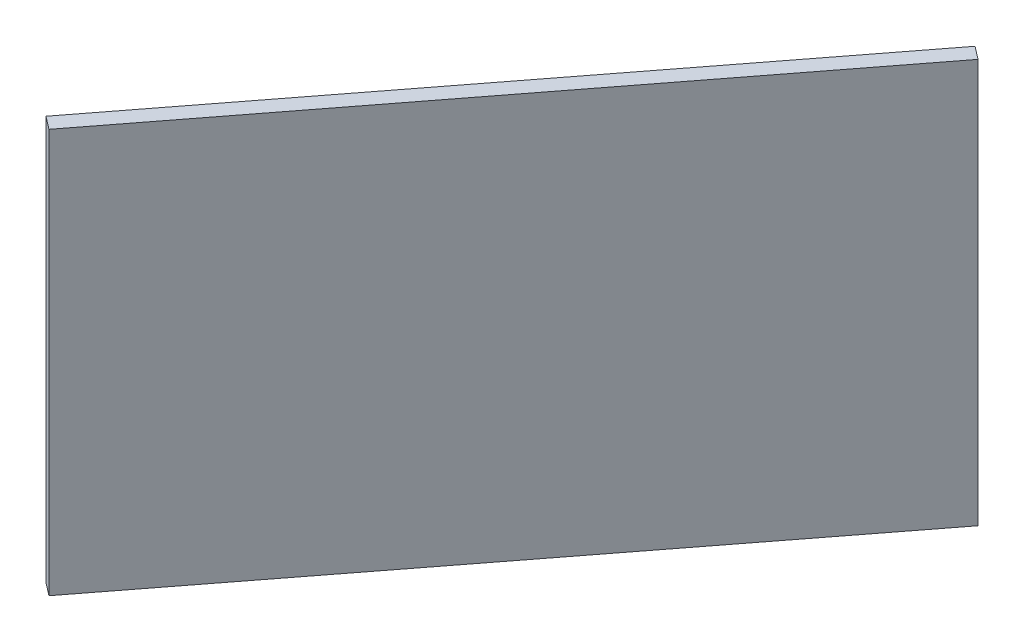
ISO-10303-21;
HEADER;
FILE_DESCRIPTION(('STEP AP214'),'2;1');
FILE_NAME('part.step','',(''),(''),'','','');
FILE_SCHEMA(('AUTOMOTIVE_DESIGN { 1 0 10303 214 1 1 1 1 }'));
ENDSEC;
DATA;
#1=APPLICATION_CONTEXT('core data for automotive mechanical design processes');
#2=APPLICATION_PROTOCOL_DEFINITION('international standard','automotive_design',2000,#1);
#3=PRODUCT_CONTEXT('',#1,'mechanical');
#4=PRODUCT('Part','Part','',(#3));
#5=PRODUCT_RELATED_PRODUCT_CATEGORY('part','',(#4));
#6=PRODUCT_DEFINITION_FORMATION('','',#4);
#7=PRODUCT_DEFINITION_CONTEXT('part definition',#1,'design');
#8=PRODUCT_DEFINITION('design','',#6,#7);
#9=PRODUCT_DEFINITION_SHAPE('','',#8);
#10=(LENGTH_UNIT() NAMED_UNIT(*) SI_UNIT(.MILLI.,.METRE.));
#11=(NAMED_UNIT(*) PLANE_ANGLE_UNIT() SI_UNIT($,.RADIAN.));
#12=(NAMED_UNIT(*) SI_UNIT($,.STERADIAN.) SOLID_ANGLE_UNIT());
#13=UNCERTAINTY_MEASURE_WITH_UNIT(LENGTH_MEASURE(1.E-05),#10,'distance_accuracy_value','');
#14=(GEOMETRIC_REPRESENTATION_CONTEXT(3) GLOBAL_UNCERTAINTY_ASSIGNED_CONTEXT((#13)) GLOBAL_UNIT_ASSIGNED_CONTEXT((#10,
#11,#12)) REPRESENTATION_CONTEXT('',''));
#15=CARTESIAN_POINT('',(0.,0.,0.));
#16=DIRECTION('',(0.,0.,1.));
#17=DIRECTION('',(1.,0.,0.));
#18=AXIS2_PLACEMENT_3D('',#15,#16,#17);
#19=CARTESIAN_POINT('',(0.792623989104622,50.,65.6097107608497));
#20=DIRECTION('',(0.609710760849693,0.,-0.7926239891046));
#21=DIRECTION('',(-0.7926239891046,0.,-0.609710760849693));
#22=AXIS2_PLACEMENT_3D('',#19,#20,#21);
#23=PLANE('',#22);
#24=DIRECTION('',(0.7926239891046,0.,0.609710760849693));
#25=VECTOR('',#24,1.);
#26=CARTESIAN_POINT('',(0.792623989104622,0.,65.6097107608497));
#27=LINE('',#26,#25);
#28=CARTESIAN_POINT('',(-0.792623989104602,0.,64.3902892391503));
#29=VERTEX_POINT('',#28);
#30=CARTESIAN_POINT('',(0.792623989104622,0.,65.6097107608497));
#31=VERTEX_POINT('',#30);
#32=EDGE_CURVE('E100',#29,#31,#27,.T.);
#33=ORIENTED_EDGE('',*,*,#32,.T.);
#34=DIRECTION('',(0.,-1.,0.));
#35=VECTOR('',#34,1.);
#36=CARTESIAN_POINT('',(0.792623989104622,50.,65.6097107608497));
#37=LINE('',#36,#35);
#38=CARTESIAN_POINT('',(0.792623989104622,50.,65.6097107608497));
#39=VERTEX_POINT('',#38);
#40=EDGE_CURVE('E11',#39,#31,#37,.T.);
#41=ORIENTED_EDGE('',*,*,#40,.F.);
#42=DIRECTION('',(0.7926239891046,0.,0.609710760849693));
#43=VECTOR('',#42,1.);
#44=CARTESIAN_POINT('',(0.792623989104622,50.,65.6097107608497));
#45=LINE('',#44,#43);
#46=CARTESIAN_POINT('',(-0.792623989104602,50.,64.3902892391503));
#47=VERTEX_POINT('',#46);
#48=EDGE_CURVE('E88',#47,#39,#45,.T.);
#49=ORIENTED_EDGE('',*,*,#48,.F.);
#50=DIRECTION('',(0.,-1.,0.));
#51=VECTOR('',#50,1.);
#52=CARTESIAN_POINT('',(-0.792623989104602,50.,64.3902892391503));
#53=LINE('',#52,#51);
#54=EDGE_CURVE('E96',#47,#29,#53,.T.);
#55=ORIENTED_EDGE('',*,*,#54,.T.);
#56=EDGE_LOOP('',(#33,#41,#49,#55));
#57=FACE_BOUND('',#56,.T.);
#58=ADVANCED_FACE('F37',(#57),#23,.F.);
#59=CARTESIAN_POINT('',(50.7926239891046,50.,0.609710760849698));
#60=DIRECTION('',(-0.7926239891046,0.,-0.609710760849692));
#61=DIRECTION('',(-0.609710760849692,0.,0.7926239891046));
#62=AXIS2_PLACEMENT_3D('',#59,#60,#61);
#63=PLANE('',#62);
#64=DIRECTION('',(0.609710760849692,0.,-0.7926239891046));
#65=VECTOR('',#64,1.);
#66=CARTESIAN_POINT('',(50.7926239891046,0.,0.609710760849698));
#67=LINE('',#66,#65);
#68=CARTESIAN_POINT('',(50.7926239891046,0.,0.609710760849698));
#69=VERTEX_POINT('',#68);
#70=EDGE_CURVE('E92',#31,#69,#67,.T.);
#71=ORIENTED_EDGE('',*,*,#70,.T.);
#72=DIRECTION('',(0.,-1.,0.));
#73=VECTOR('',#72,1.);
#74=CARTESIAN_POINT('',(50.7926239891046,50.,0.609710760849698));
#75=LINE('',#74,#73);
#76=CARTESIAN_POINT('',(50.7926239891046,50.,0.609710760849698));
#77=VERTEX_POINT('',#76);
#78=EDGE_CURVE('E45',#77,#69,#75,.T.);
#79=ORIENTED_EDGE('',*,*,#78,.F.);
#80=DIRECTION('',(0.609710760849692,0.,-0.7926239891046));
#81=VECTOR('',#80,1.);
#82=CARTESIAN_POINT('',(50.7926239891046,50.,0.609710760849698));
#83=LINE('',#82,#81);
#84=EDGE_CURVE('E83',#39,#77,#83,.T.);
#85=ORIENTED_EDGE('',*,*,#84,.F.);
#86=ORIENTED_EDGE('',*,*,#40,.T.);
#87=EDGE_LOOP('',(#71,#79,#85,#86));
#88=FACE_BOUND('',#87,.T.);
#89=ADVANCED_FACE('F91',(#88),#63,.F.);
#90=CARTESIAN_POINT('',(49.2073760108954,50.,-0.609710760849688));
#91=DIRECTION('',(-0.609710760849693,0.,0.7926239891046));
#92=DIRECTION('',(0.7926239891046,0.,0.609710760849693));
#93=AXIS2_PLACEMENT_3D('',#90,#91,#92);
#94=PLANE('',#93);
#95=DIRECTION('',(-0.7926239891046,0.,-0.609710760849693));
#96=VECTOR('',#95,1.);
#97=CARTESIAN_POINT('',(49.2073760108954,0.,-0.609710760849688));
#98=LINE('',#97,#96);
#99=CARTESIAN_POINT('',(49.2073760108954,0.,-0.609710760849688));
#100=VERTEX_POINT('',#99);
#101=EDGE_CURVE('E70',#69,#100,#98,.T.);
#102=ORIENTED_EDGE('',*,*,#101,.T.);
#103=DIRECTION('',(0.,-1.,0.));
#104=VECTOR('',#103,1.);
#105=CARTESIAN_POINT('',(49.2073760108954,50.,-0.609710760849688));
#106=LINE('',#105,#104);
#107=CARTESIAN_POINT('',(49.2073760108954,50.,-0.609710760849688));
#108=VERTEX_POINT('',#107);
#109=EDGE_CURVE('E93',#108,#100,#106,.T.);
#110=ORIENTED_EDGE('',*,*,#109,.F.);
#111=DIRECTION('',(-0.7926239891046,0.,-0.609710760849693));
#112=VECTOR('',#111,1.);
#113=CARTESIAN_POINT('',(49.2073760108954,50.,-0.609710760849688));
#114=LINE('',#113,#112);
#115=EDGE_CURVE('E86',#77,#108,#114,.T.);
#116=ORIENTED_EDGE('',*,*,#115,.F.);
#117=ORIENTED_EDGE('',*,*,#78,.T.);
#118=EDGE_LOOP('',(#102,#110,#116,#117));
#119=FACE_BOUND('',#118,.T.);
#120=ADVANCED_FACE('F94',(#119),#94,.F.);
#121=CARTESIAN_POINT('',(-0.792623989104602,50.,64.3902892391503));
#122=DIRECTION('',(0.7926239891046,0.,0.609710760849693));
#123=DIRECTION('',(0.609710760849693,0.,-0.7926239891046));
#124=AXIS2_PLACEMENT_3D('',#121,#122,#123);
#125=PLANE('',#124);
#126=DIRECTION('',(-0.609710760849693,0.,0.7926239891046));
#127=VECTOR('',#126,1.);
#128=CARTESIAN_POINT('',(-0.792623989104602,0.,64.3902892391503));
#129=LINE('',#128,#127);
#130=EDGE_CURVE('E76',#100,#29,#129,.T.);
#131=ORIENTED_EDGE('',*,*,#130,.T.);
#132=ORIENTED_EDGE('',*,*,#54,.F.);
#133=DIRECTION('',(-0.609710760849693,0.,0.7926239891046));
#134=VECTOR('',#133,1.);
#135=CARTESIAN_POINT('',(-0.792623989104602,50.,64.3902892391503));
#136=LINE('',#135,#134);
#137=EDGE_CURVE('E53',#108,#47,#136,.T.);
#138=ORIENTED_EDGE('',*,*,#137,.F.);
#139=ORIENTED_EDGE('',*,*,#109,.T.);
#140=EDGE_LOOP('',(#131,#132,#138,#139));
#141=FACE_BOUND('',#140,.T.);
#142=ADVANCED_FACE('F107',(#141),#125,.F.);
#143=CARTESIAN_POINT('',(0.,50.,0.));
#144=DIRECTION('',(0.,-1.,0.));
#145=DIRECTION('',(0.,0.,-1.));
#146=AXIS2_PLACEMENT_3D('',#143,#144,#145);
#147=PLANE('',#146);
#148=ORIENTED_EDGE('',*,*,#48,.T.);
#149=ORIENTED_EDGE('',*,*,#84,.T.);
#150=ORIENTED_EDGE('',*,*,#115,.T.);
#151=ORIENTED_EDGE('',*,*,#137,.T.);
#152=EDGE_LOOP('',(#148,#149,#150,#151));
#153=FACE_BOUND('',#152,.T.);
#154=ADVANCED_FACE('F84',(#153),#147,.F.);
#155=CARTESIAN_POINT('',(0.,0.,0.));
#156=DIRECTION('',(0.,-1.,0.));
#157=DIRECTION('',(0.,0.,-1.));
#158=AXIS2_PLACEMENT_3D('',#155,#156,#157);
#159=PLANE('',#158);
#160=ORIENTED_EDGE('',*,*,#32,.F.);
#161=ORIENTED_EDGE('',*,*,#130,.F.);
#162=ORIENTED_EDGE('',*,*,#101,.F.);
#163=ORIENTED_EDGE('',*,*,#70,.F.);
#164=EDGE_LOOP('',(#160,#161,#162,#163));
#165=FACE_BOUND('',#164,.T.);
#166=ADVANCED_FACE('F110',(#165),#159,.T.);
#167=CLOSED_SHELL('',(#58,#89,#120,#142,#154,#166));
#168=MANIFOLD_SOLID_BREP('B2',#167);
#169=ADVANCED_BREP_SHAPE_REPRESENTATION('',(#18,#168),#14);
#170=SHAPE_DEFINITION_REPRESENTATION(#9,#169);
ENDSEC;
END-ISO-10303-21;
